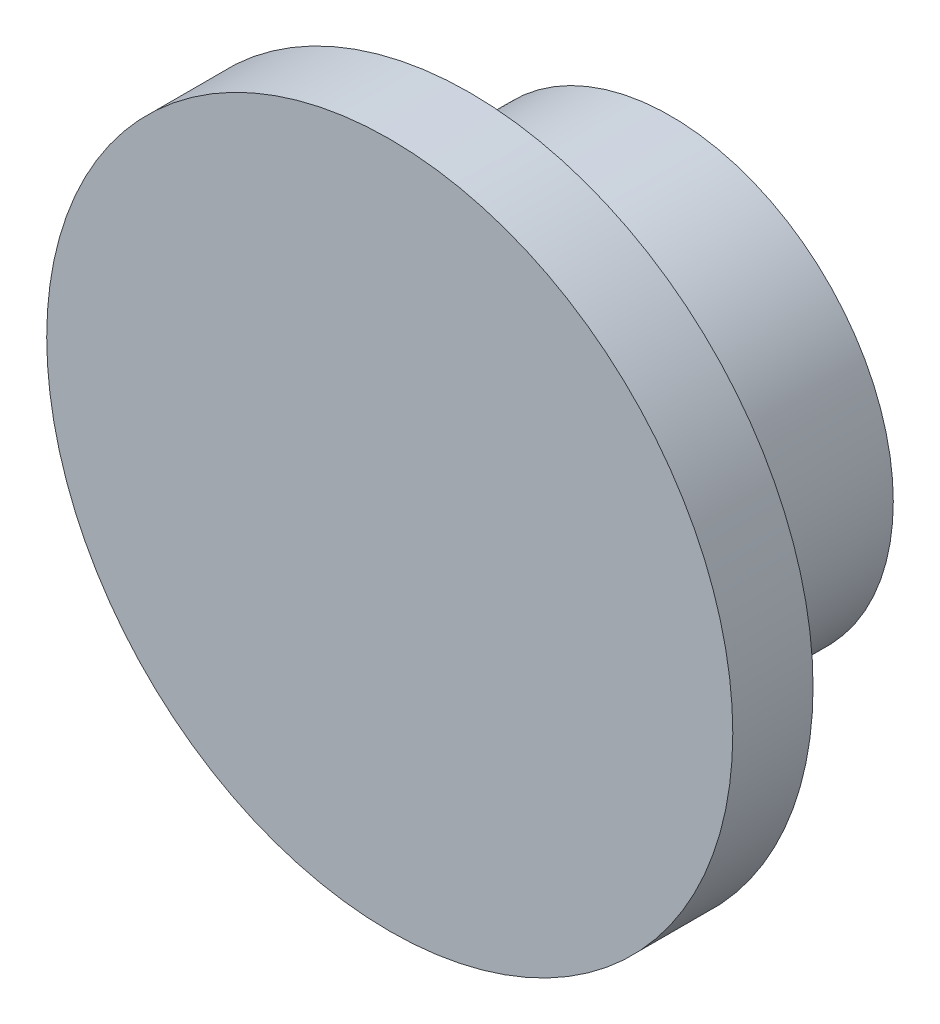
ISO-10303-21;
HEADER;
FILE_DESCRIPTION(('STEP AP214'),'2;1');
FILE_NAME('part.step','',(''),(''),'','','');
FILE_SCHEMA(('AUTOMOTIVE_DESIGN { 1 0 10303 214 1 1 1 1 }'));
ENDSEC;
DATA;
#1=APPLICATION_CONTEXT('core data for automotive mechanical design processes');
#2=APPLICATION_PROTOCOL_DEFINITION('international standard','automotive_design',2000,#1);
#3=PRODUCT_CONTEXT('',#1,'mechanical');
#4=PRODUCT('Part','Part','',(#3));
#5=PRODUCT_RELATED_PRODUCT_CATEGORY('part','',(#4));
#6=PRODUCT_DEFINITION_FORMATION('','',#4);
#7=PRODUCT_DEFINITION_CONTEXT('part definition',#1,'design');
#8=PRODUCT_DEFINITION('design','',#6,#7);
#9=PRODUCT_DEFINITION_SHAPE('','',#8);
#10=(LENGTH_UNIT() NAMED_UNIT(*) SI_UNIT(.MILLI.,.METRE.));
#11=(NAMED_UNIT(*) PLANE_ANGLE_UNIT() SI_UNIT($,.RADIAN.));
#12=(NAMED_UNIT(*) SI_UNIT($,.STERADIAN.) SOLID_ANGLE_UNIT());
#13=UNCERTAINTY_MEASURE_WITH_UNIT(LENGTH_MEASURE(1.E-05),#10,'distance_accuracy_value','');
#14=(GEOMETRIC_REPRESENTATION_CONTEXT(3) GLOBAL_UNCERTAINTY_ASSIGNED_CONTEXT((#13)) GLOBAL_UNIT_ASSIGNED_CONTEXT((#10,
#11,#12)) REPRESENTATION_CONTEXT('',''));
#15=CARTESIAN_POINT('',(0.,0.,0.));
#16=DIRECTION('',(0.,0.,1.));
#17=DIRECTION('',(1.,0.,0.));
#18=AXIS2_PLACEMENT_3D('',#15,#16,#17);
#19=CARTESIAN_POINT('',(0.,0.,-5.));
#20=DIRECTION('',(0.,0.,1.));
#21=DIRECTION('',(1.,0.,0.));
#22=AXIS2_PLACEMENT_3D('',#19,#20,#21);
#23=CYLINDRICAL_SURFACE('',#22,5.55);
#24=CARTESIAN_POINT('',(0.,0.,-5.));
#25=DIRECTION('',(0.,0.,1.));
#26=DIRECTION('',(1.,0.,0.));
#27=AXIS2_PLACEMENT_3D('',#24,#25,#26);
#28=CIRCLE('',#27,5.55);
#29=CARTESIAN_POINT('',(5.55,0.,-5.));
#30=VERTEX_POINT('',#29);
#31=EDGE_CURVE('E10',#30,#30,#28,.T.);
#32=ORIENTED_EDGE('',*,*,#31,.T.);
#33=EDGE_LOOP('',(#32));
#34=FACE_BOUND('',#33,.T.);
#35=CARTESIAN_POINT('',(0.,0.,0.));
#36=DIRECTION('',(0.,0.,1.));
#37=DIRECTION('',(1.,0.,0.));
#38=AXIS2_PLACEMENT_3D('',#35,#36,#37);
#39=CIRCLE('',#38,5.55);
#40=CARTESIAN_POINT('',(5.55,0.,0.));
#41=VERTEX_POINT('',#40);
#42=EDGE_CURVE('E46',#41,#41,#39,.T.);
#43=ORIENTED_EDGE('',*,*,#42,.F.);
#44=EDGE_LOOP('',(#43));
#45=FACE_BOUND('',#44,.T.);
#46=ADVANCED_FACE('F43',(#34,#45),#23,.T.);
#47=CARTESIAN_POINT('',(0.,0.,-5.));
#48=DIRECTION('',(0.,0.,1.));
#49=DIRECTION('',(1.,0.,0.));
#50=AXIS2_PLACEMENT_3D('',#47,#48,#49);
#51=PLANE('',#50);
#52=CARTESIAN_POINT('',(0.,0.,-5.));
#53=DIRECTION('',(0.,0.,1.));
#54=DIRECTION('',(1.,0.,0.));
#55=AXIS2_PLACEMENT_3D('',#52,#53,#54);
#56=CIRCLE('',#55,2.55);
#57=CARTESIAN_POINT('',(2.55,0.,-5.));
#58=VERTEX_POINT('',#57);
#59=EDGE_CURVE('E55',#58,#58,#56,.T.);
#60=ORIENTED_EDGE('',*,*,#59,.T.);
#61=EDGE_LOOP('',(#60));
#62=FACE_BOUND('',#61,.T.);
#63=ORIENTED_EDGE('',*,*,#31,.F.);
#64=EDGE_LOOP('',(#63));
#65=FACE_BOUND('',#64,.T.);
#66=ADVANCED_FACE('F92',(#62,#65),#51,.F.);
#67=CARTESIAN_POINT('',(0.,0.,-5.));
#68=DIRECTION('',(0.,0.,1.));
#69=DIRECTION('',(1.,0.,0.));
#70=AXIS2_PLACEMENT_3D('',#67,#68,#69);
#71=CYLINDRICAL_SURFACE('',#70,2.55);
#72=ORIENTED_EDGE('',*,*,#59,.F.);
#73=EDGE_LOOP('',(#72));
#74=FACE_BOUND('',#73,.T.);
#75=CARTESIAN_POINT('',(0.,0.,0.));
#76=DIRECTION('',(0.,0.,1.));
#77=DIRECTION('',(1.,0.,0.));
#78=AXIS2_PLACEMENT_3D('',#75,#76,#77);
#79=CIRCLE('',#78,2.55);
#80=CARTESIAN_POINT('',(2.55,0.,0.));
#81=VERTEX_POINT('',#80);
#82=EDGE_CURVE('E57',#81,#81,#79,.T.);
#83=ORIENTED_EDGE('',*,*,#82,.T.);
#84=EDGE_LOOP('',(#83));
#85=FACE_BOUND('',#84,.T.);
#86=ADVANCED_FACE('F84',(#74,#85),#71,.F.);
#87=CARTESIAN_POINT('',(0.,0.,0.));
#88=DIRECTION('',(0.,0.,1.));
#89=DIRECTION('',(1.,0.,0.));
#90=AXIS2_PLACEMENT_3D('',#87,#88,#89);
#91=PLANE('',#90);
#92=ORIENTED_EDGE('',*,*,#42,.T.);
#93=EDGE_LOOP('',(#92));
#94=FACE_BOUND('',#93,.T.);
#95=CARTESIAN_POINT('',(0.,0.,0.));
#96=DIRECTION('',(0.,0.,1.));
#97=DIRECTION('',(1.,0.,0.));
#98=AXIS2_PLACEMENT_3D('',#95,#96,#97);
#99=CIRCLE('',#98,8.55);
#100=CARTESIAN_POINT('',(8.55,0.,0.));
#101=VERTEX_POINT('',#100);
#102=EDGE_CURVE('E65',#101,#101,#99,.T.);
#103=ORIENTED_EDGE('',*,*,#102,.F.);
#104=EDGE_LOOP('',(#103));
#105=FACE_BOUND('',#104,.T.);
#106=ADVANCED_FACE('F82',(#94,#105),#91,.F.);
#107=CARTESIAN_POINT('',(0.,0.,2.));
#108=DIRECTION('',(0.,0.,1.));
#109=DIRECTION('',(1.,0.,0.));
#110=AXIS2_PLACEMENT_3D('',#107,#108,#109);
#111=PLANE('',#110);
#112=CARTESIAN_POINT('',(0.,0.,2.));
#113=DIRECTION('',(0.,0.,1.));
#114=DIRECTION('',(1.,0.,0.));
#115=AXIS2_PLACEMENT_3D('',#112,#113,#114);
#116=CIRCLE('',#115,8.55);
#117=CARTESIAN_POINT('',(8.55,0.,2.));
#118=VERTEX_POINT('',#117);
#119=EDGE_CURVE('E61',#118,#118,#116,.T.);
#120=ORIENTED_EDGE('',*,*,#119,.T.);
#121=EDGE_LOOP('',(#120));
#122=FACE_BOUND('',#121,.T.);
#123=ADVANCED_FACE('F73',(#122),#111,.T.);
#124=CARTESIAN_POINT('',(0.,0.,2.));
#125=DIRECTION('',(0.,0.,-1.));
#126=DIRECTION('',(-1.,0.,0.));
#127=AXIS2_PLACEMENT_3D('',#124,#125,#126);
#128=CYLINDRICAL_SURFACE('',#127,8.55);
#129=ORIENTED_EDGE('',*,*,#119,.F.);
#130=EDGE_LOOP('',(#129));
#131=FACE_BOUND('',#130,.T.);
#132=ORIENTED_EDGE('',*,*,#102,.T.);
#133=EDGE_LOOP('',(#132));
#134=FACE_BOUND('',#133,.T.);
#135=ADVANCED_FACE('F75',(#131,#134),#128,.T.);
#136=ORIENTED_EDGE('',*,*,#82,.F.);
#137=EDGE_LOOP('',(#136));
#138=FACE_BOUND('',#137,.T.);
#139=ADVANCED_FACE('F78',(#138),#91,.F.);
#140=CLOSED_SHELL('',(#46,#66,#86,#106,#123,#135,#139));
#141=MANIFOLD_SOLID_BREP('B2',#140);
#142=ADVANCED_BREP_SHAPE_REPRESENTATION('',(#18,#141),#14);
#143=SHAPE_DEFINITION_REPRESENTATION(#9,#142);
ENDSEC;
END-ISO-10303-21;
